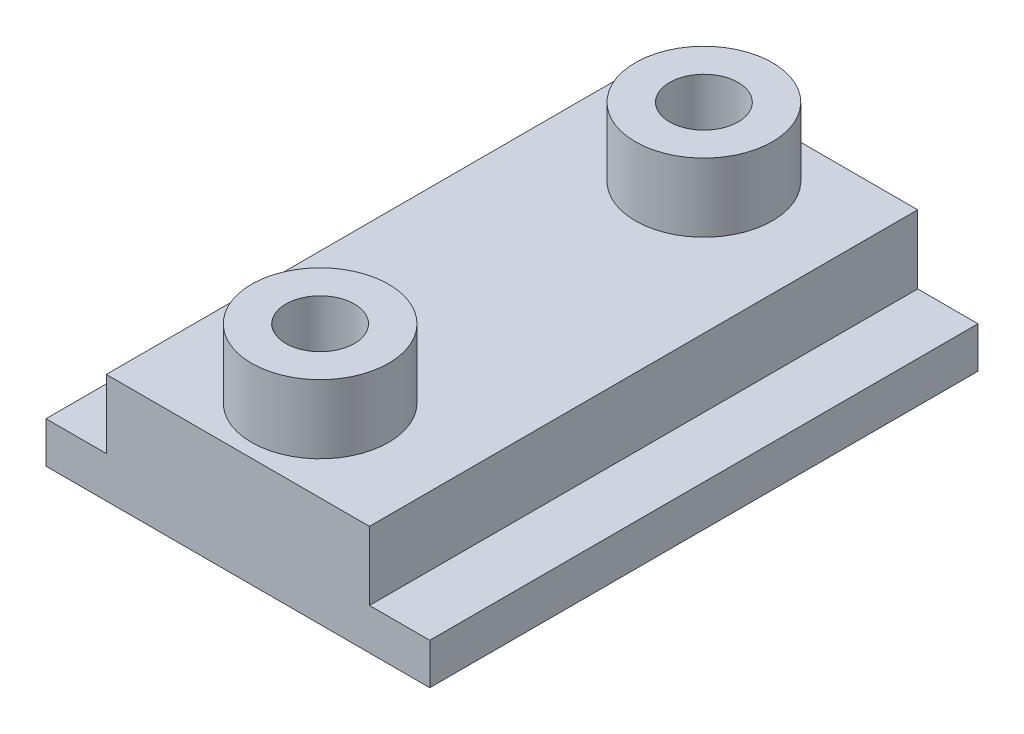
ISO-10303-21;
HEADER;
FILE_DESCRIPTION(('STEP AP214'),'2;1');
FILE_NAME('part.step','',(''),(''),'','','');
FILE_SCHEMA(('AUTOMOTIVE_DESIGN { 1 0 10303 214 1 1 1 1 }'));
ENDSEC;
DATA;
#1=APPLICATION_CONTEXT('core data for automotive mechanical design processes');
#2=APPLICATION_PROTOCOL_DEFINITION('international standard','automotive_design',2000,#1);
#3=PRODUCT_CONTEXT('',#1,'mechanical');
#4=PRODUCT('Part','Part','',(#3));
#5=PRODUCT_RELATED_PRODUCT_CATEGORY('part','',(#4));
#6=PRODUCT_DEFINITION_FORMATION('','',#4);
#7=PRODUCT_DEFINITION_CONTEXT('part definition',#1,'design');
#8=PRODUCT_DEFINITION('design','',#6,#7);
#9=PRODUCT_DEFINITION_SHAPE('','',#8);
#10=(LENGTH_UNIT() NAMED_UNIT(*) SI_UNIT(.MILLI.,.METRE.));
#11=(NAMED_UNIT(*) PLANE_ANGLE_UNIT() SI_UNIT($,.RADIAN.));
#12=(NAMED_UNIT(*) SI_UNIT($,.STERADIAN.) SOLID_ANGLE_UNIT());
#13=UNCERTAINTY_MEASURE_WITH_UNIT(LENGTH_MEASURE(1.E-05),#10,'distance_accuracy_value','');
#14=(GEOMETRIC_REPRESENTATION_CONTEXT(3) GLOBAL_UNCERTAINTY_ASSIGNED_CONTEXT((#13)) GLOBAL_UNIT_ASSIGNED_CONTEXT((#10,
#11,#12)) REPRESENTATION_CONTEXT('',''));
#15=CARTESIAN_POINT('',(0.,0.,0.));
#16=DIRECTION('',(0.,0.,1.));
#17=DIRECTION('',(1.,0.,0.));
#18=AXIS2_PLACEMENT_3D('',#15,#16,#17);
#19=CARTESIAN_POINT('',(4.8,4.,-10.));
#20=DIRECTION('',(0.,1.,0.));
#21=DIRECTION('',(0.,0.,1.));
#22=AXIS2_PLACEMENT_3D('',#19,#20,#21);
#23=PLANE('',#22);
#24=CARTESIAN_POINT('',(0.,4.,-7.));
#25=DIRECTION('',(0.,1.,0.));
#26=DIRECTION('',(0.,0.,1.));
#27=AXIS2_PLACEMENT_3D('',#24,#25,#26);
#28=CIRCLE('',#27,2.5);
#29=CARTESIAN_POINT('',(0.,4.,-4.5));
#30=VERTEX_POINT('',#29);
#31=EDGE_CURVE('E133',#30,#30,#28,.T.);
#32=ORIENTED_EDGE('',*,*,#31,.F.);
#33=EDGE_LOOP('',(#32));
#34=FACE_BOUND('',#33,.T.);
#35=DIRECTION('',(0.,0.,1.));
#36=VECTOR('',#35,1.);
#37=CARTESIAN_POINT('',(-4.8,4.,-10.));
#38=LINE('',#37,#36);
#39=CARTESIAN_POINT('',(-4.8,4.,-10.));
#40=VERTEX_POINT('',#39);
#41=CARTESIAN_POINT('',(-4.8,4.,10.));
#42=VERTEX_POINT('',#41);
#43=EDGE_CURVE('E175',#40,#42,#38,.T.);
#44=ORIENTED_EDGE('',*,*,#43,.T.);
#45=DIRECTION('',(-1.,0.,0.));
#46=VECTOR('',#45,1.);
#47=CARTESIAN_POINT('',(4.8,4.,10.));
#48=LINE('',#47,#46);
#49=CARTESIAN_POINT('',(4.8,4.,10.));
#50=VERTEX_POINT('',#49);
#51=EDGE_CURVE('E144',#50,#42,#48,.T.);
#52=ORIENTED_EDGE('',*,*,#51,.F.);
#53=DIRECTION('',(0.,0.,1.));
#54=VECTOR('',#53,1.);
#55=CARTESIAN_POINT('',(4.8,4.,-10.));
#56=LINE('',#55,#54);
#57=CARTESIAN_POINT('',(4.8,4.,-10.));
#58=VERTEX_POINT('',#57);
#59=EDGE_CURVE('E178',#58,#50,#56,.T.);
#60=ORIENTED_EDGE('',*,*,#59,.F.);
#61=DIRECTION('',(-1.,0.,0.));
#62=VECTOR('',#61,1.);
#63=CARTESIAN_POINT('',(4.8,4.,-10.));
#64=LINE('',#63,#62);
#65=EDGE_CURVE('E164',#58,#40,#64,.T.);
#66=ORIENTED_EDGE('',*,*,#65,.T.);
#67=EDGE_LOOP('',(#44,#52,#60,#66));
#68=FACE_BOUND('',#67,.T.);
#69=CARTESIAN_POINT('',(0.,4.,7.));
#70=DIRECTION('',(0.,1.,0.));
#71=DIRECTION('',(0.,0.,1.));
#72=AXIS2_PLACEMENT_3D('',#69,#70,#71);
#73=CIRCLE('',#72,2.5);
#74=CARTESIAN_POINT('',(0.,4.,9.5));
#75=VERTEX_POINT('',#74);
#76=EDGE_CURVE('E242',#75,#75,#73,.T.);
#77=ORIENTED_EDGE('',*,*,#76,.F.);
#78=EDGE_LOOP('',(#77));
#79=FACE_BOUND('',#78,.T.);
#80=ADVANCED_FACE('F40',(#34,#68,#79),#23,.T.);
#81=CARTESIAN_POINT('',(-7.,1.5,-10.));
#82=DIRECTION('',(-1.,0.,0.));
#83=DIRECTION('',(0.,0.,1.));
#84=AXIS2_PLACEMENT_3D('',#81,#82,#83);
#85=PLANE('',#84);
#86=DIRECTION('',(0.,0.,1.));
#87=VECTOR('',#86,1.);
#88=CARTESIAN_POINT('',(-7.,0.,-10.));
#89=LINE('',#88,#87);
#90=CARTESIAN_POINT('',(-7.,0.,-10.));
#91=VERTEX_POINT('',#90);
#92=CARTESIAN_POINT('',(-7.,0.,10.));
#93=VERTEX_POINT('',#92);
#94=EDGE_CURVE('E44',#91,#93,#89,.T.);
#95=ORIENTED_EDGE('',*,*,#94,.T.);
#96=DIRECTION('',(0.,-1.,0.));
#97=VECTOR('',#96,1.);
#98=CARTESIAN_POINT('',(-7.,1.5,10.));
#99=LINE('',#98,#97);
#100=CARTESIAN_POINT('',(-7.,1.5,10.));
#101=VERTEX_POINT('',#100);
#102=EDGE_CURVE('E109',#101,#93,#99,.T.);
#103=ORIENTED_EDGE('',*,*,#102,.F.);
#104=DIRECTION('',(0.,0.,1.));
#105=VECTOR('',#104,1.);
#106=CARTESIAN_POINT('',(-7.,1.5,-10.));
#107=LINE('',#106,#105);
#108=CARTESIAN_POINT('',(-7.,1.5,-10.));
#109=VERTEX_POINT('',#108);
#110=EDGE_CURVE('E11',#109,#101,#107,.T.);
#111=ORIENTED_EDGE('',*,*,#110,.F.);
#112=DIRECTION('',(0.,-1.,0.));
#113=VECTOR('',#112,1.);
#114=CARTESIAN_POINT('',(-7.,1.5,-10.));
#115=LINE('',#114,#113);
#116=EDGE_CURVE('E110',#109,#91,#115,.T.);
#117=ORIENTED_EDGE('',*,*,#116,.T.);
#118=EDGE_LOOP('',(#95,#103,#111,#117));
#119=FACE_BOUND('',#118,.T.);
#120=ADVANCED_FACE('F42',(#119),#85,.T.);
#121=CARTESIAN_POINT('',(-4.8,1.5,-10.));
#122=DIRECTION('',(0.,1.,0.));
#123=DIRECTION('',(-1.,0.,0.));
#124=AXIS2_PLACEMENT_3D('',#121,#122,#123);
#125=PLANE('',#124);
#126=ORIENTED_EDGE('',*,*,#110,.T.);
#127=DIRECTION('',(-1.,0.,0.));
#128=VECTOR('',#127,1.);
#129=CARTESIAN_POINT('',(-4.8,1.5,10.));
#130=LINE('',#129,#128);
#131=CARTESIAN_POINT('',(-4.8,1.5,10.));
#132=VERTEX_POINT('',#131);
#133=EDGE_CURVE('E128',#132,#101,#130,.T.);
#134=ORIENTED_EDGE('',*,*,#133,.F.);
#135=DIRECTION('',(0.,0.,1.));
#136=VECTOR('',#135,1.);
#137=CARTESIAN_POINT('',(-4.8,1.5,-10.));
#138=LINE('',#137,#136);
#139=CARTESIAN_POINT('',(-4.8,1.5,-10.));
#140=VERTEX_POINT('',#139);
#141=EDGE_CURVE('E50',#140,#132,#138,.T.);
#142=ORIENTED_EDGE('',*,*,#141,.F.);
#143=DIRECTION('',(-1.,0.,0.));
#144=VECTOR('',#143,1.);
#145=CARTESIAN_POINT('',(-4.8,1.5,-10.));
#146=LINE('',#145,#144);
#147=EDGE_CURVE('E116',#140,#109,#146,.T.);
#148=ORIENTED_EDGE('',*,*,#147,.T.);
#149=EDGE_LOOP('',(#126,#134,#142,#148));
#150=FACE_BOUND('',#149,.T.);
#151=ADVANCED_FACE('F207',(#150),#125,.T.);
#152=CARTESIAN_POINT('',(-4.8,4.,-10.));
#153=DIRECTION('',(-1.,0.,0.));
#154=DIRECTION('',(0.,0.,1.));
#155=AXIS2_PLACEMENT_3D('',#152,#153,#154);
#156=PLANE('',#155);
#157=ORIENTED_EDGE('',*,*,#141,.T.);
#158=DIRECTION('',(0.,-1.,0.));
#159=VECTOR('',#158,1.);
#160=CARTESIAN_POINT('',(-4.8,4.,10.));
#161=LINE('',#160,#159);
#162=EDGE_CURVE('E147',#42,#132,#161,.T.);
#163=ORIENTED_EDGE('',*,*,#162,.F.);
#164=ORIENTED_EDGE('',*,*,#43,.F.);
#165=DIRECTION('',(0.,-1.,0.));
#166=VECTOR('',#165,1.);
#167=CARTESIAN_POINT('',(-4.8,4.,-10.));
#168=LINE('',#167,#166);
#169=EDGE_CURVE('E168',#40,#140,#168,.T.);
#170=ORIENTED_EDGE('',*,*,#169,.T.);
#171=EDGE_LOOP('',(#157,#163,#164,#170));
#172=FACE_BOUND('',#171,.T.);
#173=ADVANCED_FACE('F206',(#172),#156,.T.);
#174=CARTESIAN_POINT('',(4.8,1.5,-10.));
#175=DIRECTION('',(1.,0.,0.));
#176=DIRECTION('',(0.,0.,-1.));
#177=AXIS2_PLACEMENT_3D('',#174,#175,#176);
#178=PLANE('',#177);
#179=ORIENTED_EDGE('',*,*,#59,.T.);
#180=DIRECTION('',(0.,1.,0.));
#181=VECTOR('',#180,1.);
#182=CARTESIAN_POINT('',(4.8,1.5,10.));
#183=LINE('',#182,#181);
#184=CARTESIAN_POINT('',(4.8,1.5,10.));
#185=VERTEX_POINT('',#184);
#186=EDGE_CURVE('E141',#185,#50,#183,.T.);
#187=ORIENTED_EDGE('',*,*,#186,.F.);
#188=DIRECTION('',(0.,0.,1.));
#189=VECTOR('',#188,1.);
#190=CARTESIAN_POINT('',(4.8,1.5,-10.));
#191=LINE('',#190,#189);
#192=CARTESIAN_POINT('',(4.8,1.5,-10.));
#193=VERTEX_POINT('',#192);
#194=EDGE_CURVE('E181',#193,#185,#191,.T.);
#195=ORIENTED_EDGE('',*,*,#194,.F.);
#196=DIRECTION('',(0.,1.,0.));
#197=VECTOR('',#196,1.);
#198=CARTESIAN_POINT('',(4.8,1.5,-10.));
#199=LINE('',#198,#197);
#200=EDGE_CURVE('E161',#193,#58,#199,.T.);
#201=ORIENTED_EDGE('',*,*,#200,.T.);
#202=EDGE_LOOP('',(#179,#187,#195,#201));
#203=FACE_BOUND('',#202,.T.);
#204=ADVANCED_FACE('F195',(#203),#178,.T.);
#205=CARTESIAN_POINT('',(7.,1.5,-10.));
#206=DIRECTION('',(0.,1.,0.));
#207=DIRECTION('',(-1.,0.,0.));
#208=AXIS2_PLACEMENT_3D('',#205,#206,#207);
#209=PLANE('',#208);
#210=ORIENTED_EDGE('',*,*,#194,.T.);
#211=DIRECTION('',(-1.,0.,0.));
#212=VECTOR('',#211,1.);
#213=CARTESIAN_POINT('',(7.,1.5,10.));
#214=LINE('',#213,#212);
#215=CARTESIAN_POINT('',(7.,1.5,10.));
#216=VERTEX_POINT('',#215);
#217=EDGE_CURVE('E138',#216,#185,#214,.T.);
#218=ORIENTED_EDGE('',*,*,#217,.F.);
#219=DIRECTION('',(0.,0.,1.));
#220=VECTOR('',#219,1.);
#221=CARTESIAN_POINT('',(7.,1.5,-10.));
#222=LINE('',#221,#220);
#223=CARTESIAN_POINT('',(7.,1.5,-10.));
#224=VERTEX_POINT('',#223);
#225=EDGE_CURVE('E184',#224,#216,#222,.T.);
#226=ORIENTED_EDGE('',*,*,#225,.F.);
#227=DIRECTION('',(-1.,0.,0.));
#228=VECTOR('',#227,1.);
#229=CARTESIAN_POINT('',(7.,1.5,-10.));
#230=LINE('',#229,#228);
#231=EDGE_CURVE('E158',#224,#193,#230,.T.);
#232=ORIENTED_EDGE('',*,*,#231,.T.);
#233=EDGE_LOOP('',(#210,#218,#226,#232));
#234=FACE_BOUND('',#233,.T.);
#235=ADVANCED_FACE('F192',(#234),#209,.T.);
#236=CARTESIAN_POINT('',(7.,0.,-10.));
#237=DIRECTION('',(1.,0.,0.));
#238=DIRECTION('',(0.,0.,-1.));
#239=AXIS2_PLACEMENT_3D('',#236,#237,#238);
#240=PLANE('',#239);
#241=ORIENTED_EDGE('',*,*,#225,.T.);
#242=DIRECTION('',(0.,1.,0.));
#243=VECTOR('',#242,1.);
#244=CARTESIAN_POINT('',(7.,0.,10.));
#245=LINE('',#244,#243);
#246=CARTESIAN_POINT('',(7.,0.,10.));
#247=VERTEX_POINT('',#246);
#248=EDGE_CURVE('E123',#247,#216,#245,.T.);
#249=ORIENTED_EDGE('',*,*,#248,.F.);
#250=DIRECTION('',(0.,0.,1.));
#251=VECTOR('',#250,1.);
#252=CARTESIAN_POINT('',(7.,0.,-10.));
#253=LINE('',#252,#251);
#254=CARTESIAN_POINT('',(7.,0.,-10.));
#255=VERTEX_POINT('',#254);
#256=EDGE_CURVE('E115',#255,#247,#253,.T.);
#257=ORIENTED_EDGE('',*,*,#256,.F.);
#258=DIRECTION('',(0.,1.,0.));
#259=VECTOR('',#258,1.);
#260=CARTESIAN_POINT('',(7.,0.,-10.));
#261=LINE('',#260,#259);
#262=EDGE_CURVE('E155',#255,#224,#261,.T.);
#263=ORIENTED_EDGE('',*,*,#262,.T.);
#264=EDGE_LOOP('',(#241,#249,#257,#263));
#265=FACE_BOUND('',#264,.T.);
#266=ADVANCED_FACE('F186',(#265),#240,.T.);
#267=CARTESIAN_POINT('',(-7.,0.,-10.));
#268=DIRECTION('',(0.,-1.,0.));
#269=DIRECTION('',(0.,0.,-1.));
#270=AXIS2_PLACEMENT_3D('',#267,#268,#269);
#271=PLANE('',#270);
#272=CARTESIAN_POINT('',(0.,0.,7.));
#273=DIRECTION('',(0.,1.,0.));
#274=DIRECTION('',(0.,0.,1.));
#275=AXIS2_PLACEMENT_3D('',#272,#273,#274);
#276=CIRCLE('',#275,1.25);
#277=CARTESIAN_POINT('',(0.,0.,8.25));
#278=VERTEX_POINT('',#277);
#279=EDGE_CURVE('E236',#278,#278,#276,.T.);
#280=ORIENTED_EDGE('',*,*,#279,.T.);
#281=EDGE_LOOP('',(#280));
#282=FACE_BOUND('',#281,.T.);
#283=CARTESIAN_POINT('',(0.,0.,-7.));
#284=DIRECTION('',(0.,1.,0.));
#285=DIRECTION('',(0.,0.,1.));
#286=AXIS2_PLACEMENT_3D('',#283,#284,#285);
#287=CIRCLE('',#286,1.25);
#288=CARTESIAN_POINT('',(0.,0.,-5.75));
#289=VERTEX_POINT('',#288);
#290=EDGE_CURVE('E239',#289,#289,#287,.T.);
#291=ORIENTED_EDGE('',*,*,#290,.T.);
#292=EDGE_LOOP('',(#291));
#293=FACE_BOUND('',#292,.T.);
#294=ORIENTED_EDGE('',*,*,#256,.T.);
#295=DIRECTION('',(1.,0.,0.));
#296=VECTOR('',#295,1.);
#297=CARTESIAN_POINT('',(-7.,0.,10.));
#298=LINE('',#297,#296);
#299=EDGE_CURVE('E118',#93,#247,#298,.T.);
#300=ORIENTED_EDGE('',*,*,#299,.F.);
#301=ORIENTED_EDGE('',*,*,#94,.F.);
#302=DIRECTION('',(1.,0.,0.));
#303=VECTOR('',#302,1.);
#304=CARTESIAN_POINT('',(-7.,0.,-10.));
#305=LINE('',#304,#303);
#306=EDGE_CURVE('E152',#91,#255,#305,.T.);
#307=ORIENTED_EDGE('',*,*,#306,.T.);
#308=EDGE_LOOP('',(#294,#300,#301,#307));
#309=FACE_BOUND('',#308,.T.);
#310=ADVANCED_FACE('F119',(#282,#293,#309),#271,.T.);
#311=CARTESIAN_POINT('',(0.,0.,-10.));
#312=DIRECTION('',(0.,0.,1.));
#313=DIRECTION('',(1.,0.,0.));
#314=AXIS2_PLACEMENT_3D('',#311,#312,#313);
#315=PLANE('',#314);
#316=ORIENTED_EDGE('',*,*,#116,.F.);
#317=ORIENTED_EDGE('',*,*,#147,.F.);
#318=ORIENTED_EDGE('',*,*,#169,.F.);
#319=ORIENTED_EDGE('',*,*,#65,.F.);
#320=ORIENTED_EDGE('',*,*,#200,.F.);
#321=ORIENTED_EDGE('',*,*,#231,.F.);
#322=ORIENTED_EDGE('',*,*,#262,.F.);
#323=ORIENTED_EDGE('',*,*,#306,.F.);
#324=EDGE_LOOP('',(#316,#317,#318,#319,#320,#321,#322,#323));
#325=FACE_BOUND('',#324,.T.);
#326=ADVANCED_FACE('F198',(#325),#315,.F.);
#327=CARTESIAN_POINT('',(0.,0.,10.));
#328=DIRECTION('',(0.,0.,1.));
#329=DIRECTION('',(1.,0.,0.));
#330=AXIS2_PLACEMENT_3D('',#327,#328,#329);
#331=PLANE('',#330);
#332=ORIENTED_EDGE('',*,*,#102,.T.);
#333=ORIENTED_EDGE('',*,*,#299,.T.);
#334=ORIENTED_EDGE('',*,*,#248,.T.);
#335=ORIENTED_EDGE('',*,*,#217,.T.);
#336=ORIENTED_EDGE('',*,*,#186,.T.);
#337=ORIENTED_EDGE('',*,*,#51,.T.);
#338=ORIENTED_EDGE('',*,*,#162,.T.);
#339=ORIENTED_EDGE('',*,*,#133,.T.);
#340=EDGE_LOOP('',(#332,#333,#334,#335,#336,#337,#338,#339));
#341=FACE_BOUND('',#340,.T.);
#342=ADVANCED_FACE('F126',(#341),#331,.T.);
#343=CARTESIAN_POINT('',(0.,6.5,-7.));
#344=DIRECTION('',(0.,-1.,0.));
#345=DIRECTION('',(0.,0.,-1.));
#346=AXIS2_PLACEMENT_3D('',#343,#344,#345);
#347=CYLINDRICAL_SURFACE('',#346,2.5);
#348=CARTESIAN_POINT('',(0.,6.5,-7.));
#349=DIRECTION('',(0.,1.,0.));
#350=DIRECTION('',(0.,0.,1.));
#351=AXIS2_PLACEMENT_3D('',#348,#349,#350);
#352=CIRCLE('',#351,2.5);
#353=CARTESIAN_POINT('',(0.,6.5,-4.5));
#354=VERTEX_POINT('',#353);
#355=EDGE_CURVE('E129',#354,#354,#352,.T.);
#356=ORIENTED_EDGE('',*,*,#355,.F.);
#357=EDGE_LOOP('',(#356));
#358=FACE_BOUND('',#357,.T.);
#359=ORIENTED_EDGE('',*,*,#31,.T.);
#360=EDGE_LOOP('',(#359));
#361=FACE_BOUND('',#360,.T.);
#362=ADVANCED_FACE('F259',(#358,#361),#347,.T.);
#363=CARTESIAN_POINT('',(0.,6.5,-7.));
#364=DIRECTION('',(0.,1.,0.));
#365=DIRECTION('',(0.,0.,1.));
#366=AXIS2_PLACEMENT_3D('',#363,#364,#365);
#367=PLANE('',#366);
#368=CARTESIAN_POINT('',(0.,6.5,-7.));
#369=DIRECTION('',(0.,1.,0.));
#370=DIRECTION('',(0.,0.,1.));
#371=AXIS2_PLACEMENT_3D('',#368,#369,#370);
#372=CIRCLE('',#371,1.25);
#373=CARTESIAN_POINT('',(0.,6.5,-5.75));
#374=VERTEX_POINT('',#373);
#375=EDGE_CURVE('E243',#374,#374,#372,.T.);
#376=ORIENTED_EDGE('',*,*,#375,.F.);
#377=EDGE_LOOP('',(#376));
#378=FACE_BOUND('',#377,.T.);
#379=ORIENTED_EDGE('',*,*,#355,.T.);
#380=EDGE_LOOP('',(#379));
#381=FACE_BOUND('',#380,.T.);
#382=ADVANCED_FACE('F261',(#378,#381),#367,.T.);
#383=CARTESIAN_POINT('',(0.,6.5,7.));
#384=DIRECTION('',(0.,-1.,0.));
#385=DIRECTION('',(0.,0.,-1.));
#386=AXIS2_PLACEMENT_3D('',#383,#384,#385);
#387=CYLINDRICAL_SURFACE('',#386,2.5);
#388=CARTESIAN_POINT('',(0.,6.5,7.));
#389=DIRECTION('',(0.,1.,0.));
#390=DIRECTION('',(0.,0.,1.));
#391=AXIS2_PLACEMENT_3D('',#388,#389,#390);
#392=CIRCLE('',#391,2.5);
#393=CARTESIAN_POINT('',(0.,6.5,9.5));
#394=VERTEX_POINT('',#393);
#395=EDGE_CURVE('E246',#394,#394,#392,.T.);
#396=ORIENTED_EDGE('',*,*,#395,.F.);
#397=EDGE_LOOP('',(#396));
#398=FACE_BOUND('',#397,.T.);
#399=ORIENTED_EDGE('',*,*,#76,.T.);
#400=EDGE_LOOP('',(#399));
#401=FACE_BOUND('',#400,.T.);
#402=ADVANCED_FACE('F268',(#398,#401),#387,.T.);
#403=CARTESIAN_POINT('',(0.,6.5,7.));
#404=DIRECTION('',(0.,1.,0.));
#405=DIRECTION('',(0.,0.,1.));
#406=AXIS2_PLACEMENT_3D('',#403,#404,#405);
#407=PLANE('',#406);
#408=CARTESIAN_POINT('',(0.,6.5,7.));
#409=DIRECTION('',(0.,1.,0.));
#410=DIRECTION('',(0.,0.,1.));
#411=AXIS2_PLACEMENT_3D('',#408,#409,#410);
#412=CIRCLE('',#411,1.25);
#413=CARTESIAN_POINT('',(0.,6.5,8.25));
#414=VERTEX_POINT('',#413);
#415=EDGE_CURVE('E292',#414,#414,#412,.T.);
#416=ORIENTED_EDGE('',*,*,#415,.F.);
#417=EDGE_LOOP('',(#416));
#418=FACE_BOUND('',#417,.T.);
#419=ORIENTED_EDGE('',*,*,#395,.T.);
#420=EDGE_LOOP('',(#419));
#421=FACE_BOUND('',#420,.T.);
#422=ADVANCED_FACE('F276',(#418,#421),#407,.T.);
#423=CARTESIAN_POINT('',(0.,6.5,-7.));
#424=DIRECTION('',(0.,1.,0.));
#425=DIRECTION('',(0.,0.,1.));
#426=AXIS2_PLACEMENT_3D('',#423,#424,#425);
#427=CYLINDRICAL_SURFACE('',#426,1.25);
#428=ORIENTED_EDGE('',*,*,#290,.F.);
#429=EDGE_LOOP('',(#428));
#430=FACE_BOUND('',#429,.T.);
#431=ORIENTED_EDGE('',*,*,#375,.T.);
#432=EDGE_LOOP('',(#431));
#433=FACE_BOUND('',#432,.T.);
#434=ADVANCED_FACE('F280',(#430,#433),#427,.F.);
#435=CARTESIAN_POINT('',(0.,6.5,7.));
#436=DIRECTION('',(0.,1.,0.));
#437=DIRECTION('',(0.,0.,1.));
#438=AXIS2_PLACEMENT_3D('',#435,#436,#437);
#439=CYLINDRICAL_SURFACE('',#438,1.25);
#440=ORIENTED_EDGE('',*,*,#279,.F.);
#441=EDGE_LOOP('',(#440));
#442=FACE_BOUND('',#441,.T.);
#443=ORIENTED_EDGE('',*,*,#415,.T.);
#444=EDGE_LOOP('',(#443));
#445=FACE_BOUND('',#444,.T.);
#446=ADVANCED_FACE('F284',(#442,#445),#439,.F.);
#447=CLOSED_SHELL('',(#80,#120,#151,#173,#204,#235,#266,#310,#326,#342,#362,#382,#402,#422,#434,#446));
#448=MANIFOLD_SOLID_BREP('B2',#447);
#449=ADVANCED_BREP_SHAPE_REPRESENTATION('',(#18,#448),#14);
#450=SHAPE_DEFINITION_REPRESENTATION(#9,#449);
ENDSEC;
END-ISO-10303-21;
